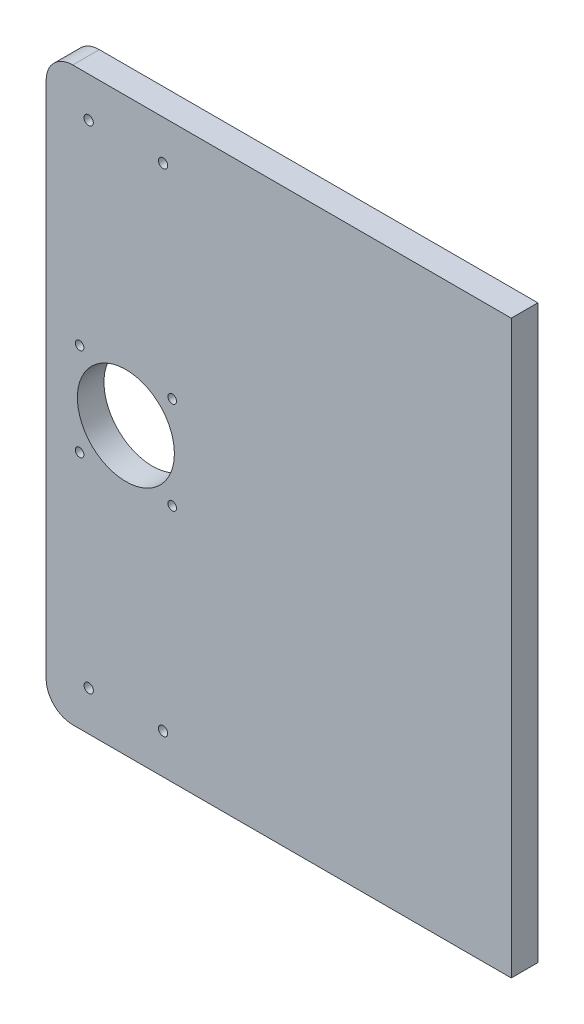
ISO-10303-21;
HEADER;
FILE_DESCRIPTION(('STEP AP214'),'2;1');
FILE_NAME('part.step','',(''),(''),'','','');
FILE_SCHEMA(('AUTOMOTIVE_DESIGN { 1 0 10303 214 1 1 1 1 }'));
ENDSEC;
DATA;
#1=APPLICATION_CONTEXT('core data for automotive mechanical design processes');
#2=APPLICATION_PROTOCOL_DEFINITION('international standard','automotive_design',2000,#1);
#3=PRODUCT_CONTEXT('',#1,'mechanical');
#4=PRODUCT('Part','Part','',(#3));
#5=PRODUCT_RELATED_PRODUCT_CATEGORY('part','',(#4));
#6=PRODUCT_DEFINITION_FORMATION('','',#4);
#7=PRODUCT_DEFINITION_CONTEXT('part definition',#1,'design');
#8=PRODUCT_DEFINITION('design','',#6,#7);
#9=PRODUCT_DEFINITION_SHAPE('','',#8);
#10=(LENGTH_UNIT() NAMED_UNIT(*) SI_UNIT(.MILLI.,.METRE.));
#11=(NAMED_UNIT(*) PLANE_ANGLE_UNIT() SI_UNIT($,.RADIAN.));
#12=(NAMED_UNIT(*) SI_UNIT($,.STERADIAN.) SOLID_ANGLE_UNIT());
#13=UNCERTAINTY_MEASURE_WITH_UNIT(LENGTH_MEASURE(1.E-05),#10,'distance_accuracy_value','');
#14=(GEOMETRIC_REPRESENTATION_CONTEXT(3) GLOBAL_UNCERTAINTY_ASSIGNED_CONTEXT((#13)) GLOBAL_UNIT_ASSIGNED_CONTEXT((#10,
#11,#12)) REPRESENTATION_CONTEXT('',''));
#15=CARTESIAN_POINT('',(0.,0.,0.));
#16=DIRECTION('',(0.,0.,1.));
#17=DIRECTION('',(1.,0.,0.));
#18=AXIS2_PLACEMENT_3D('',#15,#16,#17);
#19=CARTESIAN_POINT('',(290.,0.,20.));
#20=DIRECTION('',(1.,0.,0.));
#21=DIRECTION('',(0.,0.,-1.));
#22=AXIS2_PLACEMENT_3D('',#19,#20,#21);
#23=PLANE('',#22);
#24=DIRECTION('',(0.,-1.,0.));
#25=VECTOR('',#24,1.);
#26=CARTESIAN_POINT('',(290.,0.,0.));
#27=LINE('',#26,#25);
#28=CARTESIAN_POINT('',(290.,215.,0.));
#29=VERTEX_POINT('',#28);
#30=CARTESIAN_POINT('',(290.,-215.,0.));
#31=VERTEX_POINT('',#30);
#32=EDGE_CURVE('E104',#29,#31,#27,.T.);
#33=ORIENTED_EDGE('',*,*,#32,.F.);
#34=DIRECTION('',(0.,0.,-1.));
#35=VECTOR('',#34,1.);
#36=CARTESIAN_POINT('',(290.,215.,20.));
#37=LINE('',#36,#35);
#38=CARTESIAN_POINT('',(290.,215.,20.));
#39=VERTEX_POINT('',#38);
#40=EDGE_CURVE('E92',#39,#29,#37,.T.);
#41=ORIENTED_EDGE('',*,*,#40,.F.);
#42=DIRECTION('',(0.,-1.,0.));
#43=VECTOR('',#42,1.);
#44=CARTESIAN_POINT('',(290.,0.,20.));
#45=LINE('',#44,#43);
#46=CARTESIAN_POINT('',(290.,-215.,20.));
#47=VERTEX_POINT('',#46);
#48=EDGE_CURVE('E98',#39,#47,#45,.T.);
#49=ORIENTED_EDGE('',*,*,#48,.T.);
#50=DIRECTION('',(0.,0.,-1.));
#51=VECTOR('',#50,1.);
#52=CARTESIAN_POINT('',(290.,-215.,20.));
#53=LINE('',#52,#51);
#54=EDGE_CURVE('E106',#47,#31,#53,.T.);
#55=ORIENTED_EDGE('',*,*,#54,.T.);
#56=EDGE_LOOP('',(#33,#41,#49,#55));
#57=FACE_BOUND('',#56,.T.);
#58=ADVANCED_FACE('F37',(#57),#23,.T.);
#59=CARTESIAN_POINT('',(0.,215.,20.));
#60=DIRECTION('',(0.,1.,0.));
#61=DIRECTION('',(0.,0.,1.));
#62=AXIS2_PLACEMENT_3D('',#59,#60,#61);
#63=PLANE('',#62);
#64=DIRECTION('',(1.,0.,0.));
#65=VECTOR('',#64,1.);
#66=CARTESIAN_POINT('',(0.,215.,0.));
#67=LINE('',#66,#65);
#68=CARTESIAN_POINT('',(-39.9999999999999,215.,0.));
#69=VERTEX_POINT('',#68);
#70=EDGE_CURVE('E150',#69,#29,#67,.T.);
#71=ORIENTED_EDGE('',*,*,#70,.F.);
#72=DIRECTION('',(0.,0.,-1.));
#73=VECTOR('',#72,1.);
#74=CARTESIAN_POINT('',(-39.9999999999999,215.,20.));
#75=LINE('',#74,#73);
#76=CARTESIAN_POINT('',(-39.9999999999999,215.,20.));
#77=VERTEX_POINT('',#76);
#78=EDGE_CURVE('E11',#69,#77,#75,.F.);
#79=ORIENTED_EDGE('',*,*,#78,.T.);
#80=DIRECTION('',(1.,0.,0.));
#81=VECTOR('',#80,1.);
#82=CARTESIAN_POINT('',(0.,215.,20.));
#83=LINE('',#82,#81);
#84=EDGE_CURVE('E89',#77,#39,#83,.T.);
#85=ORIENTED_EDGE('',*,*,#84,.T.);
#86=ORIENTED_EDGE('',*,*,#40,.T.);
#87=EDGE_LOOP('',(#71,#79,#85,#86));
#88=FACE_BOUND('',#87,.T.);
#89=ADVANCED_FACE('F91',(#88),#63,.T.);
#90=CARTESIAN_POINT('',(-59.9999999999999,0.,20.));
#91=DIRECTION('',(1.,0.,0.));
#92=DIRECTION('',(0.,0.,-1.));
#93=AXIS2_PLACEMENT_3D('',#90,#91,#92);
#94=PLANE('',#93);
#95=DIRECTION('',(0.,-1.,0.));
#96=VECTOR('',#95,1.);
#97=CARTESIAN_POINT('',(-59.9999999999999,0.,0.));
#98=LINE('',#97,#96);
#99=CARTESIAN_POINT('',(-59.9999999999999,195.,0.));
#100=VERTEX_POINT('',#99);
#101=CARTESIAN_POINT('',(-59.9999999999999,-195.,0.));
#102=VERTEX_POINT('',#101);
#103=EDGE_CURVE('E152',#100,#102,#98,.T.);
#104=ORIENTED_EDGE('',*,*,#103,.T.);
#105=DIRECTION('',(0.,0.,-1.));
#106=VECTOR('',#105,1.);
#107=CARTESIAN_POINT('',(-59.9999999999999,-195.,20.));
#108=LINE('',#107,#106);
#109=CARTESIAN_POINT('',(-59.9999999999999,-195.,20.));
#110=VERTEX_POINT('',#109);
#111=EDGE_CURVE('E58',#102,#110,#108,.F.);
#112=ORIENTED_EDGE('',*,*,#111,.T.);
#113=DIRECTION('',(0.,-1.,0.));
#114=VECTOR('',#113,1.);
#115=CARTESIAN_POINT('',(-59.9999999999999,0.,20.));
#116=LINE('',#115,#114);
#117=CARTESIAN_POINT('',(-59.9999999999999,195.,20.));
#118=VERTEX_POINT('',#117);
#119=EDGE_CURVE('E97',#118,#110,#116,.T.);
#120=ORIENTED_EDGE('',*,*,#119,.F.);
#121=DIRECTION('',(0.,0.,-1.));
#122=VECTOR('',#121,1.);
#123=CARTESIAN_POINT('',(-59.9999999999999,195.,0.));
#124=LINE('',#123,#122);
#125=EDGE_CURVE('E170',#118,#100,#124,.T.);
#126=ORIENTED_EDGE('',*,*,#125,.T.);
#127=EDGE_LOOP('',(#104,#112,#120,#126));
#128=FACE_BOUND('',#127,.T.);
#129=ADVANCED_FACE('F186',(#128),#94,.F.);
#130=CARTESIAN_POINT('',(28.,-185.,20.));
#131=DIRECTION('',(0.,0.,-1.));
#132=DIRECTION('',(-1.,0.,0.));
#133=AXIS2_PLACEMENT_3D('',#130,#131,#132);
#134=CYLINDRICAL_SURFACE('',#133,3.5);
#135=CARTESIAN_POINT('',(28.,-185.,20.));
#136=DIRECTION('',(0.,0.,1.));
#137=DIRECTION('',(1.,0.,0.));
#138=AXIS2_PLACEMENT_3D('',#135,#136,#137);
#139=CIRCLE('',#138,3.5);
#140=CARTESIAN_POINT('',(31.5,-185.,20.));
#141=VERTEX_POINT('',#140);
#142=EDGE_CURVE('E122',#141,#141,#139,.T.);
#143=ORIENTED_EDGE('',*,*,#142,.T.);
#144=EDGE_LOOP('',(#143));
#145=FACE_BOUND('',#144,.T.);
#146=CARTESIAN_POINT('',(28.,-185.,0.));
#147=DIRECTION('',(0.,0.,1.));
#148=DIRECTION('',(1.,0.,0.));
#149=AXIS2_PLACEMENT_3D('',#146,#147,#148);
#150=CIRCLE('',#149,3.5);
#151=CARTESIAN_POINT('',(31.5,-185.,0.));
#152=VERTEX_POINT('',#151);
#153=EDGE_CURVE('E156',#152,#152,#150,.T.);
#154=ORIENTED_EDGE('',*,*,#153,.F.);
#155=EDGE_LOOP('',(#154));
#156=FACE_BOUND('',#155,.T.);
#157=ADVANCED_FACE('F265',(#145,#156),#134,.F.);
#158=CARTESIAN_POINT('',(0.,-215.,20.));
#159=DIRECTION('',(0.,1.,0.));
#160=DIRECTION('',(0.,0.,1.));
#161=AXIS2_PLACEMENT_3D('',#158,#159,#160);
#162=PLANE('',#161);
#163=DIRECTION('',(1.,0.,0.));
#164=VECTOR('',#163,1.);
#165=CARTESIAN_POINT('',(0.,-215.,20.));
#166=LINE('',#165,#164);
#167=CARTESIAN_POINT('',(-39.9999999999999,-215.,20.));
#168=VERTEX_POINT('',#167);
#169=EDGE_CURVE('E111',#168,#47,#166,.T.);
#170=ORIENTED_EDGE('',*,*,#169,.F.);
#171=DIRECTION('',(0.,0.,-1.));
#172=VECTOR('',#171,1.);
#173=CARTESIAN_POINT('',(-39.9999999999999,-215.,20.));
#174=LINE('',#173,#172);
#175=CARTESIAN_POINT('',(-39.9999999999999,-215.,0.));
#176=VERTEX_POINT('',#175);
#177=EDGE_CURVE('E105',#168,#176,#174,.T.);
#178=ORIENTED_EDGE('',*,*,#177,.T.);
#179=DIRECTION('',(1.,0.,0.));
#180=VECTOR('',#179,1.);
#181=CARTESIAN_POINT('',(0.,-215.,0.));
#182=LINE('',#181,#180);
#183=EDGE_CURVE('E154',#176,#31,#182,.T.);
#184=ORIENTED_EDGE('',*,*,#183,.T.);
#185=ORIENTED_EDGE('',*,*,#54,.F.);
#186=EDGE_LOOP('',(#170,#178,#184,#185));
#187=FACE_BOUND('',#186,.T.);
#188=ADVANCED_FACE('F179',(#187),#162,.F.);
#189=CARTESIAN_POINT('',(-28.,185.,20.));
#190=DIRECTION('',(0.,0.,-1.));
#191=DIRECTION('',(-1.,0.,0.));
#192=AXIS2_PLACEMENT_3D('',#189,#190,#191);
#193=CYLINDRICAL_SURFACE('',#192,3.5);
#194=CARTESIAN_POINT('',(-28.,185.,20.));
#195=DIRECTION('',(0.,0.,1.));
#196=DIRECTION('',(1.,0.,0.));
#197=AXIS2_PLACEMENT_3D('',#194,#195,#196);
#198=CIRCLE('',#197,3.5);
#199=CARTESIAN_POINT('',(-24.5,185.,20.));
#200=VERTEX_POINT('',#199);
#201=EDGE_CURVE('E113',#200,#200,#198,.T.);
#202=ORIENTED_EDGE('',*,*,#201,.T.);
#203=EDGE_LOOP('',(#202));
#204=FACE_BOUND('',#203,.T.);
#205=CARTESIAN_POINT('',(-28.,185.,0.));
#206=DIRECTION('',(0.,0.,1.));
#207=DIRECTION('',(1.,0.,0.));
#208=AXIS2_PLACEMENT_3D('',#205,#206,#207);
#209=CIRCLE('',#208,3.5);
#210=CARTESIAN_POINT('',(-24.5,185.,0.));
#211=VERTEX_POINT('',#210);
#212=EDGE_CURVE('E146',#211,#211,#209,.T.);
#213=ORIENTED_EDGE('',*,*,#212,.F.);
#214=EDGE_LOOP('',(#213));
#215=FACE_BOUND('',#214,.T.);
#216=ADVANCED_FACE('F201',(#204,#215),#193,.F.);
#217=CARTESIAN_POINT('',(28.,185.,20.));
#218=DIRECTION('',(0.,0.,-1.));
#219=DIRECTION('',(-1.,0.,0.));
#220=AXIS2_PLACEMENT_3D('',#217,#218,#219);
#221=CYLINDRICAL_SURFACE('',#220,3.5);
#222=CARTESIAN_POINT('',(28.,185.,20.));
#223=DIRECTION('',(0.,0.,1.));
#224=DIRECTION('',(1.,0.,0.));
#225=AXIS2_PLACEMENT_3D('',#222,#223,#224);
#226=CIRCLE('',#225,3.5);
#227=CARTESIAN_POINT('',(31.5,185.,20.));
#228=VERTEX_POINT('',#227);
#229=EDGE_CURVE('E116',#228,#228,#226,.F.);
#230=ORIENTED_EDGE('',*,*,#229,.F.);
#231=EDGE_LOOP('',(#230));
#232=FACE_BOUND('',#231,.T.);
#233=CARTESIAN_POINT('',(28.,185.,0.));
#234=DIRECTION('',(0.,0.,1.));
#235=DIRECTION('',(1.,0.,0.));
#236=AXIS2_PLACEMENT_3D('',#233,#234,#235);
#237=CIRCLE('',#236,3.5);
#238=CARTESIAN_POINT('',(31.5,185.,0.));
#239=VERTEX_POINT('',#238);
#240=EDGE_CURVE('E143',#239,#239,#237,.F.);
#241=ORIENTED_EDGE('',*,*,#240,.T.);
#242=EDGE_LOOP('',(#241));
#243=FACE_BOUND('',#242,.T.);
#244=ADVANCED_FACE('F204',(#232,#243),#221,.F.);
#245=CARTESIAN_POINT('',(0.,0.,20.));
#246=DIRECTION('',(0.,0.,-1.));
#247=DIRECTION('',(-1.,0.,0.));
#248=AXIS2_PLACEMENT_3D('',#245,#246,#247);
#249=CYLINDRICAL_SURFACE('',#248,36.5);
#250=CARTESIAN_POINT('',(0.,0.,20.));
#251=DIRECTION('',(0.,0.,1.));
#252=DIRECTION('',(1.,0.,0.));
#253=AXIS2_PLACEMENT_3D('',#250,#251,#252);
#254=CIRCLE('',#253,36.5);
#255=CARTESIAN_POINT('',(36.5,0.,20.));
#256=VERTEX_POINT('',#255);
#257=EDGE_CURVE('E395',#256,#256,#254,.T.);
#258=ORIENTED_EDGE('',*,*,#257,.T.);
#259=EDGE_LOOP('',(#258));
#260=FACE_BOUND('',#259,.T.);
#261=CARTESIAN_POINT('',(0.,0.,0.));
#262=DIRECTION('',(0.,0.,1.));
#263=DIRECTION('',(1.,0.,0.));
#264=AXIS2_PLACEMENT_3D('',#261,#262,#263);
#265=CIRCLE('',#264,36.5);
#266=CARTESIAN_POINT('',(36.5,0.,0.));
#267=VERTEX_POINT('',#266);
#268=EDGE_CURVE('E140',#267,#267,#265,.T.);
#269=ORIENTED_EDGE('',*,*,#268,.F.);
#270=EDGE_LOOP('',(#269));
#271=FACE_BOUND('',#270,.T.);
#272=ADVANCED_FACE('F208',(#260,#271),#249,.F.);
#273=CARTESIAN_POINT('',(-34.8499999999996,34.85,20.));
#274=DIRECTION('',(0.,0.,-1.));
#275=DIRECTION('',(-1.,0.,0.));
#276=AXIS2_PLACEMENT_3D('',#273,#274,#275);
#277=CYLINDRICAL_SURFACE('',#276,3.25);
#278=CARTESIAN_POINT('',(-34.8499999999996,34.85,20.));
#279=DIRECTION('',(0.,0.,1.));
#280=DIRECTION('',(1.,0.,0.));
#281=AXIS2_PLACEMENT_3D('',#278,#279,#280);
#282=CIRCLE('',#281,3.25);
#283=CARTESIAN_POINT('',(-31.5999999999996,34.85,20.));
#284=VERTEX_POINT('',#283);
#285=EDGE_CURVE('E391',#284,#284,#282,.T.);
#286=ORIENTED_EDGE('',*,*,#285,.T.);
#287=EDGE_LOOP('',(#286));
#288=FACE_BOUND('',#287,.T.);
#289=CARTESIAN_POINT('',(-34.8499999999996,34.85,0.));
#290=DIRECTION('',(0.,0.,1.));
#291=DIRECTION('',(1.,0.,0.));
#292=AXIS2_PLACEMENT_3D('',#289,#290,#291);
#293=CIRCLE('',#292,3.25);
#294=CARTESIAN_POINT('',(-31.5999999999996,34.85,0.));
#295=VERTEX_POINT('',#294);
#296=EDGE_CURVE('E137',#295,#295,#293,.T.);
#297=ORIENTED_EDGE('',*,*,#296,.F.);
#298=EDGE_LOOP('',(#297));
#299=FACE_BOUND('',#298,.T.);
#300=ADVANCED_FACE('F212',(#288,#299),#277,.F.);
#301=CARTESIAN_POINT('',(34.8499999999996,34.85,20.));
#302=DIRECTION('',(0.,0.,-1.));
#303=DIRECTION('',(-1.,0.,0.));
#304=AXIS2_PLACEMENT_3D('',#301,#302,#303);
#305=CYLINDRICAL_SURFACE('',#304,3.25);
#306=CARTESIAN_POINT('',(34.8499999999996,34.85,20.));
#307=DIRECTION('',(0.,0.,1.));
#308=DIRECTION('',(1.,0.,0.));
#309=AXIS2_PLACEMENT_3D('',#306,#307,#308);
#310=CIRCLE('',#309,3.25);
#311=CARTESIAN_POINT('',(38.0999999999996,34.85,20.));
#312=VERTEX_POINT('',#311);
#313=EDGE_CURVE('E387',#312,#312,#310,.T.);
#314=ORIENTED_EDGE('',*,*,#313,.T.);
#315=EDGE_LOOP('',(#314));
#316=FACE_BOUND('',#315,.T.);
#317=CARTESIAN_POINT('',(34.8499999999996,34.85,0.));
#318=DIRECTION('',(0.,0.,1.));
#319=DIRECTION('',(1.,0.,0.));
#320=AXIS2_PLACEMENT_3D('',#317,#318,#319);
#321=CIRCLE('',#320,3.25);
#322=CARTESIAN_POINT('',(38.0999999999996,34.85,0.));
#323=VERTEX_POINT('',#322);
#324=EDGE_CURVE('E134',#323,#323,#321,.T.);
#325=ORIENTED_EDGE('',*,*,#324,.F.);
#326=EDGE_LOOP('',(#325));
#327=FACE_BOUND('',#326,.T.);
#328=ADVANCED_FACE('F216',(#316,#327),#305,.F.);
#329=CARTESIAN_POINT('',(34.8499999999996,-34.85,20.));
#330=DIRECTION('',(0.,0.,-1.));
#331=DIRECTION('',(-1.,0.,0.));
#332=AXIS2_PLACEMENT_3D('',#329,#330,#331);
#333=CYLINDRICAL_SURFACE('',#332,3.25);
#334=CARTESIAN_POINT('',(34.8499999999996,-34.85,20.));
#335=DIRECTION('',(0.,0.,1.));
#336=DIRECTION('',(1.,0.,0.));
#337=AXIS2_PLACEMENT_3D('',#334,#335,#336);
#338=CIRCLE('',#337,3.25);
#339=CARTESIAN_POINT('',(38.0999999999996,-34.85,20.));
#340=VERTEX_POINT('',#339);
#341=EDGE_CURVE('E383',#340,#340,#338,.T.);
#342=ORIENTED_EDGE('',*,*,#341,.T.);
#343=EDGE_LOOP('',(#342));
#344=FACE_BOUND('',#343,.T.);
#345=CARTESIAN_POINT('',(34.8499999999996,-34.85,0.));
#346=DIRECTION('',(0.,0.,1.));
#347=DIRECTION('',(1.,0.,0.));
#348=AXIS2_PLACEMENT_3D('',#345,#346,#347);
#349=CIRCLE('',#348,3.25);
#350=CARTESIAN_POINT('',(38.0999999999996,-34.85,0.));
#351=VERTEX_POINT('',#350);
#352=EDGE_CURVE('E131',#351,#351,#349,.T.);
#353=ORIENTED_EDGE('',*,*,#352,.F.);
#354=EDGE_LOOP('',(#353));
#355=FACE_BOUND('',#354,.T.);
#356=ADVANCED_FACE('F220',(#344,#355),#333,.F.);
#357=CARTESIAN_POINT('',(-34.8499999999996,-34.85,20.));
#358=DIRECTION('',(0.,0.,-1.));
#359=DIRECTION('',(-1.,0.,0.));
#360=AXIS2_PLACEMENT_3D('',#357,#358,#359);
#361=CYLINDRICAL_SURFACE('',#360,3.25);
#362=CARTESIAN_POINT('',(-34.8499999999996,-34.85,20.));
#363=DIRECTION('',(0.,0.,1.));
#364=DIRECTION('',(1.,0.,0.));
#365=AXIS2_PLACEMENT_3D('',#362,#363,#364);
#366=CIRCLE('',#365,3.25);
#367=CARTESIAN_POINT('',(-31.5999999999996,-34.85,20.));
#368=VERTEX_POINT('',#367);
#369=EDGE_CURVE('E162',#368,#368,#366,.T.);
#370=ORIENTED_EDGE('',*,*,#369,.T.);
#371=EDGE_LOOP('',(#370));
#372=FACE_BOUND('',#371,.T.);
#373=CARTESIAN_POINT('',(-34.8499999999996,-34.85,0.));
#374=DIRECTION('',(0.,0.,1.));
#375=DIRECTION('',(1.,0.,0.));
#376=AXIS2_PLACEMENT_3D('',#373,#374,#375);
#377=CIRCLE('',#376,3.25);
#378=CARTESIAN_POINT('',(-31.5999999999996,-34.85,0.));
#379=VERTEX_POINT('',#378);
#380=EDGE_CURVE('E128',#379,#379,#377,.T.);
#381=ORIENTED_EDGE('',*,*,#380,.F.);
#382=EDGE_LOOP('',(#381));
#383=FACE_BOUND('',#382,.T.);
#384=ADVANCED_FACE('F224',(#372,#383),#361,.F.);
#385=CARTESIAN_POINT('',(-28.,-185.,20.));
#386=DIRECTION('',(0.,0.,-1.));
#387=DIRECTION('',(-1.,0.,0.));
#388=AXIS2_PLACEMENT_3D('',#385,#386,#387);
#389=CYLINDRICAL_SURFACE('',#388,3.49999999999999);
#390=CARTESIAN_POINT('',(-28.,-185.,20.));
#391=DIRECTION('',(0.,0.,1.));
#392=DIRECTION('',(1.,0.,0.));
#393=AXIS2_PLACEMENT_3D('',#390,#391,#392);
#394=CIRCLE('',#393,3.49999999999999);
#395=CARTESIAN_POINT('',(-24.5,-185.,20.));
#396=VERTEX_POINT('',#395);
#397=EDGE_CURVE('E125',#396,#396,#394,.F.);
#398=ORIENTED_EDGE('',*,*,#397,.F.);
#399=EDGE_LOOP('',(#398));
#400=FACE_BOUND('',#399,.T.);
#401=CARTESIAN_POINT('',(-28.,-185.,0.));
#402=DIRECTION('',(0.,0.,1.));
#403=DIRECTION('',(1.,0.,0.));
#404=AXIS2_PLACEMENT_3D('',#401,#402,#403);
#405=CIRCLE('',#404,3.49999999999999);
#406=CARTESIAN_POINT('',(-24.5,-185.,0.));
#407=VERTEX_POINT('',#406);
#408=EDGE_CURVE('E159',#407,#407,#405,.F.);
#409=ORIENTED_EDGE('',*,*,#408,.T.);
#410=EDGE_LOOP('',(#409));
#411=FACE_BOUND('',#410,.T.);
#412=ADVANCED_FACE('F227',(#400,#411),#389,.F.);
#413=CARTESIAN_POINT('',(0.,0.,20.));
#414=DIRECTION('',(0.,0.,1.));
#415=DIRECTION('',(1.,0.,0.));
#416=AXIS2_PLACEMENT_3D('',#413,#414,#415);
#417=PLANE('',#416);
#418=ORIENTED_EDGE('',*,*,#369,.F.);
#419=EDGE_LOOP('',(#418));
#420=FACE_BOUND('',#419,.T.);
#421=ORIENTED_EDGE('',*,*,#341,.F.);
#422=EDGE_LOOP('',(#421));
#423=FACE_BOUND('',#422,.T.);
#424=ORIENTED_EDGE('',*,*,#313,.F.);
#425=EDGE_LOOP('',(#424));
#426=FACE_BOUND('',#425,.T.);
#427=ORIENTED_EDGE('',*,*,#285,.F.);
#428=EDGE_LOOP('',(#427));
#429=FACE_BOUND('',#428,.T.);
#430=ORIENTED_EDGE('',*,*,#257,.F.);
#431=EDGE_LOOP('',(#430));
#432=FACE_BOUND('',#431,.T.);
#433=ORIENTED_EDGE('',*,*,#229,.T.);
#434=EDGE_LOOP('',(#433));
#435=FACE_BOUND('',#434,.T.);
#436=ORIENTED_EDGE('',*,*,#201,.F.);
#437=EDGE_LOOP('',(#436));
#438=FACE_BOUND('',#437,.T.);
#439=ORIENTED_EDGE('',*,*,#119,.T.);
#440=CARTESIAN_POINT('',(-39.9999999999999,-195.,20.));
#441=DIRECTION('',(0.,0.,1.));
#442=DIRECTION('',(1.,0.,0.));
#443=AXIS2_PLACEMENT_3D('',#440,#441,#442);
#444=CIRCLE('',#443,20.);
#445=EDGE_CURVE('E45',#110,#168,#444,.T.);
#446=ORIENTED_EDGE('',*,*,#445,.T.);
#447=ORIENTED_EDGE('',*,*,#169,.T.);
#448=ORIENTED_EDGE('',*,*,#48,.F.);
#449=ORIENTED_EDGE('',*,*,#84,.F.);
#450=CARTESIAN_POINT('',(-39.9999999999999,195.,20.));
#451=DIRECTION('',(0.,0.,1.));
#452=DIRECTION('',(1.,0.,0.));
#453=AXIS2_PLACEMENT_3D('',#450,#451,#452);
#454=CIRCLE('',#453,20.);
#455=EDGE_CURVE('E174',#77,#118,#454,.T.);
#456=ORIENTED_EDGE('',*,*,#455,.T.);
#457=EDGE_LOOP('',(#439,#446,#447,#448,#449,#456));
#458=FACE_BOUND('',#457,.T.);
#459=ORIENTED_EDGE('',*,*,#142,.F.);
#460=EDGE_LOOP('',(#459));
#461=FACE_BOUND('',#460,.T.);
#462=ORIENTED_EDGE('',*,*,#397,.T.);
#463=EDGE_LOOP('',(#462));
#464=FACE_BOUND('',#463,.T.);
#465=ADVANCED_FACE('F108',(#420,#423,#426,#429,#432,#435,#438,#458,#461,#464),#417,.T.);
#466=CARTESIAN_POINT('',(0.,0.,0.));
#467=DIRECTION('',(0.,0.,1.));
#468=DIRECTION('',(1.,0.,0.));
#469=AXIS2_PLACEMENT_3D('',#466,#467,#468);
#470=PLANE('',#469);
#471=ORIENTED_EDGE('',*,*,#380,.T.);
#472=EDGE_LOOP('',(#471));
#473=FACE_BOUND('',#472,.T.);
#474=ORIENTED_EDGE('',*,*,#352,.T.);
#475=EDGE_LOOP('',(#474));
#476=FACE_BOUND('',#475,.T.);
#477=ORIENTED_EDGE('',*,*,#324,.T.);
#478=EDGE_LOOP('',(#477));
#479=FACE_BOUND('',#478,.T.);
#480=ORIENTED_EDGE('',*,*,#296,.T.);
#481=EDGE_LOOP('',(#480));
#482=FACE_BOUND('',#481,.T.);
#483=ORIENTED_EDGE('',*,*,#268,.T.);
#484=EDGE_LOOP('',(#483));
#485=FACE_BOUND('',#484,.T.);
#486=ORIENTED_EDGE('',*,*,#240,.F.);
#487=EDGE_LOOP('',(#486));
#488=FACE_BOUND('',#487,.T.);
#489=ORIENTED_EDGE('',*,*,#212,.T.);
#490=EDGE_LOOP('',(#489));
#491=FACE_BOUND('',#490,.T.);
#492=ORIENTED_EDGE('',*,*,#183,.F.);
#493=CARTESIAN_POINT('',(-39.9999999999999,-195.,0.));
#494=DIRECTION('',(0.,0.,1.));
#495=DIRECTION('',(1.,0.,0.));
#496=AXIS2_PLACEMENT_3D('',#493,#494,#495);
#497=CIRCLE('',#496,20.);
#498=EDGE_CURVE('E168',#176,#102,#497,.F.);
#499=ORIENTED_EDGE('',*,*,#498,.T.);
#500=ORIENTED_EDGE('',*,*,#103,.F.);
#501=CARTESIAN_POINT('',(-39.9999999999999,195.,0.));
#502=DIRECTION('',(0.,0.,1.));
#503=DIRECTION('',(1.,0.,0.));
#504=AXIS2_PLACEMENT_3D('',#501,#502,#503);
#505=CIRCLE('',#504,20.);
#506=EDGE_CURVE('E166',#100,#69,#505,.F.);
#507=ORIENTED_EDGE('',*,*,#506,.T.);
#508=ORIENTED_EDGE('',*,*,#70,.T.);
#509=ORIENTED_EDGE('',*,*,#32,.T.);
#510=EDGE_LOOP('',(#492,#499,#500,#507,#508,#509));
#511=FACE_BOUND('',#510,.T.);
#512=ORIENTED_EDGE('',*,*,#153,.T.);
#513=EDGE_LOOP('',(#512));
#514=FACE_BOUND('',#513,.T.);
#515=ORIENTED_EDGE('',*,*,#408,.F.);
#516=EDGE_LOOP('',(#515));
#517=FACE_BOUND('',#516,.T.);
#518=ADVANCED_FACE('F184',(#473,#476,#479,#482,#485,#488,#491,#511,#514,#517),#470,.F.);
#519=CARTESIAN_POINT('',(-39.9999999999999,-195.,20.));
#520=DIRECTION('',(0.,0.,-1.));
#521=DIRECTION('',(-1.,0.,0.));
#522=AXIS2_PLACEMENT_3D('',#519,#520,#521);
#523=CYLINDRICAL_SURFACE('',#522,20.);
#524=ORIENTED_EDGE('',*,*,#445,.F.);
#525=ORIENTED_EDGE('',*,*,#111,.F.);
#526=ORIENTED_EDGE('',*,*,#498,.F.);
#527=ORIENTED_EDGE('',*,*,#177,.F.);
#528=EDGE_LOOP('',(#524,#525,#526,#527));
#529=FACE_BOUND('',#528,.T.);
#530=ADVANCED_FACE('F181',(#529),#523,.T.);
#531=CARTESIAN_POINT('',(-39.9999999999999,195.,20.));
#532=DIRECTION('',(0.,0.,1.));
#533=DIRECTION('',(1.,0.,0.));
#534=AXIS2_PLACEMENT_3D('',#531,#532,#533);
#535=CYLINDRICAL_SURFACE('',#534,20.);
#536=ORIENTED_EDGE('',*,*,#455,.F.);
#537=ORIENTED_EDGE('',*,*,#78,.F.);
#538=ORIENTED_EDGE('',*,*,#506,.F.);
#539=ORIENTED_EDGE('',*,*,#125,.F.);
#540=EDGE_LOOP('',(#536,#537,#538,#539));
#541=FACE_BOUND('',#540,.T.);
#542=ADVANCED_FACE('F39',(#541),#535,.T.);
#543=CLOSED_SHELL('',(#58,#89,#129,#157,#188,#216,#244,#272,#300,#328,#356,#384,#412,#465,#518,
#530,#542));
#544=MANIFOLD_SOLID_BREP('B2',#543);
#545=ADVANCED_BREP_SHAPE_REPRESENTATION('',(#18,#544),#14);
#546=SHAPE_DEFINITION_REPRESENTATION(#9,#545);
ENDSEC;
END-ISO-10303-21;
